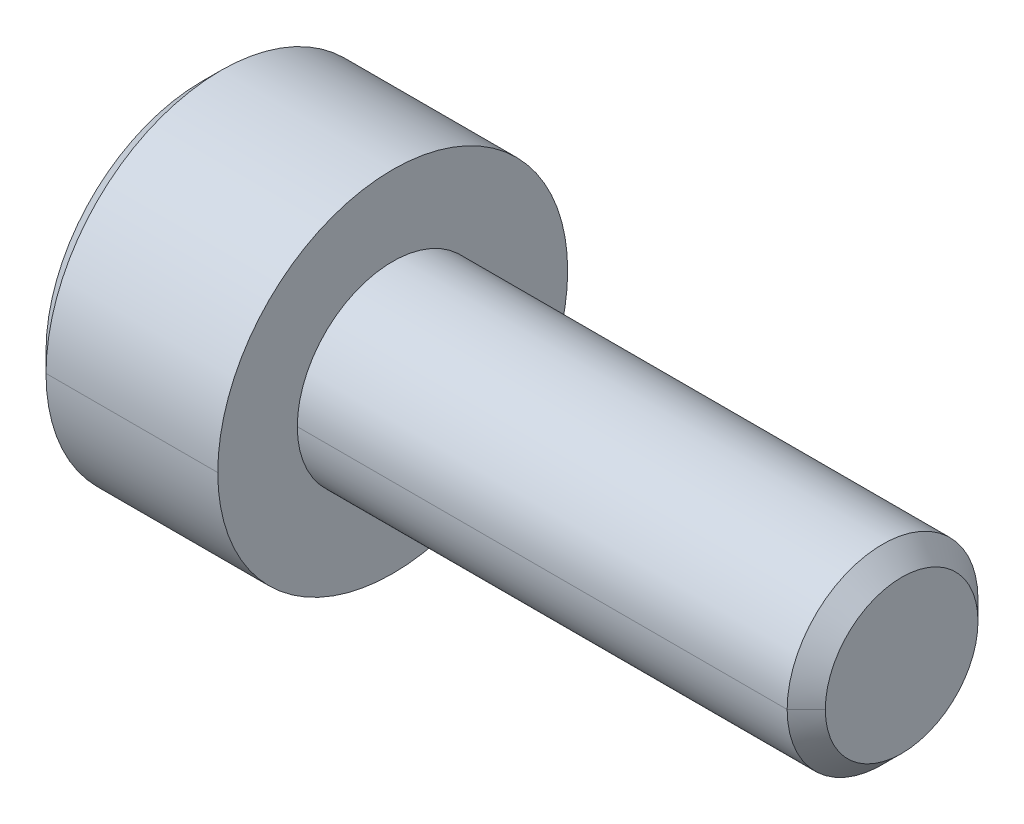
ISO-10303-21;
HEADER;
FILE_DESCRIPTION(('STEP AP214'),'2;1');
FILE_NAME('part.step','',(''),(''),'','','');
FILE_SCHEMA(('AUTOMOTIVE_DESIGN { 1 0 10303 214 1 1 1 1 }'));
ENDSEC;
DATA;
#1=APPLICATION_CONTEXT('core data for automotive mechanical design processes');
#2=APPLICATION_PROTOCOL_DEFINITION('international standard','automotive_design',2000,#1);
#3=PRODUCT_CONTEXT('',#1,'mechanical');
#4=PRODUCT('Part','Part','',(#3));
#5=PRODUCT_RELATED_PRODUCT_CATEGORY('part','',(#4));
#6=PRODUCT_DEFINITION_FORMATION('','',#4);
#7=PRODUCT_DEFINITION_CONTEXT('part definition',#1,'design');
#8=PRODUCT_DEFINITION('design','',#6,#7);
#9=PRODUCT_DEFINITION_SHAPE('','',#8);
#10=(LENGTH_UNIT() NAMED_UNIT(*) SI_UNIT(.MILLI.,.METRE.));
#11=(NAMED_UNIT(*) PLANE_ANGLE_UNIT() SI_UNIT($,.RADIAN.));
#12=(NAMED_UNIT(*) SI_UNIT($,.STERADIAN.) SOLID_ANGLE_UNIT());
#13=UNCERTAINTY_MEASURE_WITH_UNIT(LENGTH_MEASURE(1.E-05),#10,'distance_accuracy_value','');
#14=(GEOMETRIC_REPRESENTATION_CONTEXT(3) GLOBAL_UNCERTAINTY_ASSIGNED_CONTEXT((#13)) GLOBAL_UNIT_ASSIGNED_CONTEXT((#10,
#11,#12)) REPRESENTATION_CONTEXT('',''));
#15=CARTESIAN_POINT('',(0.,0.,0.));
#16=DIRECTION('',(0.,0.,1.));
#17=DIRECTION('',(1.,0.,0.));
#18=AXIS2_PLACEMENT_3D('',#15,#16,#17);
#19=CARTESIAN_POINT('',(-7.2334200260078,3.0068762394076,1.73602080624187));
#20=DIRECTION('',(0.901523057468274,-0.374756097535173,-0.216365533792385));
#21=DIRECTION('',(0.,0.5,-0.866025403784439));
#22=AXIS2_PLACEMENT_3D('',#19,#20,#21);
#23=PLANE('',#22);
#24=DIRECTION('',(0.383848537659809,0.461698034470699,0.799684453457937));
#25=VECTOR('',#24,1.);
#26=CARTESIAN_POINT('',(-9.5,-0.721687836487032,-1.25));
#27=LINE('',#26,#25);
#28=CARTESIAN_POINT('',(-9.5,-0.721687836487032,-1.25));
#29=VERTEX_POINT('',#28);
#30=CARTESIAN_POINT('',(-8.9,0.,0.));
#31=VERTEX_POINT('',#30);
#32=EDGE_CURVE('E258',#29,#31,#27,.T.);
#33=ORIENTED_EDGE('',*,*,#32,.F.);
#34=CARTESIAN_POINT('',(-9.5,-0.721687836487032,-1.25));
#35=CARTESIAN_POINT('',(-9.5,-0.962250448649377,-0.833333333333333));
#36=CARTESIAN_POINT('',(-9.5,-1.20281306081172,-0.416666666666666));
#37=CARTESIAN_POINT('',(-9.5,-1.44337567297406,0.));
#38=(BOUNDED_CURVE() B_SPLINE_CURVE(3,(#34,#35,#36,#37),.UNSPECIFIED.,.F.,
.F.) B_SPLINE_CURVE_WITH_KNOTS((4,4),(0.,1.),
.UNSPECIFIED.) CURVE() GEOMETRIC_REPRESENTATION_ITEM() RATIONAL_B_SPLINE_CURVE((1.,1.,1.,1.)) REPRESENTATION_ITEM(''));
#39=CARTESIAN_POINT('',(-9.5,-1.44337567297406,0.));
#40=VERTEX_POINT('',#39);
#41=EDGE_CURVE('E210',#29,#40,#38,.T.);
#42=ORIENTED_EDGE('',*,*,#41,.T.);
#43=DIRECTION('',(0.383848537659809,0.923396068941397,0.));
#44=VECTOR('',#43,1.);
#45=CARTESIAN_POINT('',(-9.5,-1.44337567297406,0.));
#46=LINE('',#45,#44);
#47=EDGE_CURVE('E10',#40,#31,#46,.T.);
#48=ORIENTED_EDGE('',*,*,#47,.T.);
#49=EDGE_LOOP('',(#33,#42,#48));
#50=FACE_BOUND('',#49,.T.);
#51=ADVANCED_FACE('F16',(#50),#23,.F.);
#52=CARTESIAN_POINT('',(-7.23342002600781,3.00687623940761,-1.73602080624187));
#53=DIRECTION('',(0.901523057468274,-0.374756097535173,0.216365533792385));
#54=DIRECTION('',(0.,-0.5,-0.866025403784439));
#55=AXIS2_PLACEMENT_3D('',#52,#53,#54);
#56=PLANE('',#55);
#57=ORIENTED_EDGE('',*,*,#47,.F.);
#58=CARTESIAN_POINT('',(-9.5,-1.44337567297406,0.));
#59=CARTESIAN_POINT('',(-9.5,-1.20281306081172,0.416666666666667));
#60=CARTESIAN_POINT('',(-9.5,-0.962250448649377,0.833333333333334));
#61=CARTESIAN_POINT('',(-9.5,-0.721687836487033,1.25));
#62=(BOUNDED_CURVE() B_SPLINE_CURVE(3,(#58,#59,#60,#61),.UNSPECIFIED.,.F.,
.F.) B_SPLINE_CURVE_WITH_KNOTS((4,4),(0.,1.),
.UNSPECIFIED.) CURVE() GEOMETRIC_REPRESENTATION_ITEM() RATIONAL_B_SPLINE_CURVE((1.,1.,1.,1.)) REPRESENTATION_ITEM(''));
#63=CARTESIAN_POINT('',(-9.5,-0.721687836487033,1.25));
#64=VERTEX_POINT('',#63);
#65=EDGE_CURVE('E196',#40,#64,#62,.T.);
#66=ORIENTED_EDGE('',*,*,#65,.T.);
#67=DIRECTION('',(0.383848537659809,0.461698034470699,-0.799684453457937));
#68=VECTOR('',#67,1.);
#69=CARTESIAN_POINT('',(-9.5,-0.721687836487033,1.25));
#70=LINE('',#69,#68);
#71=EDGE_CURVE('E27',#64,#31,#70,.T.);
#72=ORIENTED_EDGE('',*,*,#71,.T.);
#73=EDGE_LOOP('',(#57,#66,#72));
#74=FACE_BOUND('',#73,.T.);
#75=ADVANCED_FACE('F307',(#74),#56,.F.);
#76=CARTESIAN_POINT('',(-7.2334200260078,0.,-3.47204161248374));
#77=DIRECTION('',(0.901523057468274,0.,0.432731067584772));
#78=DIRECTION('',(0.,-1.,0.));
#79=AXIS2_PLACEMENT_3D('',#76,#77,#78);
#80=PLANE('',#79);
#81=ORIENTED_EDGE('',*,*,#71,.F.);
#82=CARTESIAN_POINT('',(-9.5,-0.721687836487033,1.25));
#83=CARTESIAN_POINT('',(-9.5,-0.240562612162345,1.25));
#84=CARTESIAN_POINT('',(-9.5,0.240562612162344,1.25));
#85=CARTESIAN_POINT('',(-9.5,0.721687836487033,1.25));
#86=(BOUNDED_CURVE() B_SPLINE_CURVE(3,(#82,#83,#84,#85),.UNSPECIFIED.,.F.,
.F.) B_SPLINE_CURVE_WITH_KNOTS((4,4),(0.,1.),
.UNSPECIFIED.) CURVE() GEOMETRIC_REPRESENTATION_ITEM() RATIONAL_B_SPLINE_CURVE((1.,1.,1.,1.)) REPRESENTATION_ITEM(''));
#87=CARTESIAN_POINT('',(-9.5,0.721687836487033,1.25));
#88=VERTEX_POINT('',#87);
#89=EDGE_CURVE('E136',#64,#88,#86,.T.);
#90=ORIENTED_EDGE('',*,*,#89,.T.);
#91=DIRECTION('',(0.383848537659809,-0.461698034470699,-0.799684453457937));
#92=VECTOR('',#91,1.);
#93=CARTESIAN_POINT('',(-9.5,0.721687836487033,1.25));
#94=LINE('',#93,#92);
#95=EDGE_CURVE('E265',#88,#31,#94,.T.);
#96=ORIENTED_EDGE('',*,*,#95,.T.);
#97=EDGE_LOOP('',(#81,#90,#96));
#98=FACE_BOUND('',#97,.T.);
#99=ADVANCED_FACE('F310',(#98),#80,.F.);
#100=CARTESIAN_POINT('',(-7.2334200260078,-3.00687623940761,-1.73602080624188));
#101=DIRECTION('',(0.901523057468274,0.374756097535173,0.216365533792385));
#102=DIRECTION('',(0.,0.5,-0.866025403784439));
#103=AXIS2_PLACEMENT_3D('',#100,#101,#102);
#104=PLANE('',#103);
#105=ORIENTED_EDGE('',*,*,#95,.F.);
#106=CARTESIAN_POINT('',(-9.5,0.721687836487033,1.25));
#107=CARTESIAN_POINT('',(-9.5,0.962250448649376,0.833333333333332));
#108=CARTESIAN_POINT('',(-9.5,1.20281306081172,0.416666666666666));
#109=CARTESIAN_POINT('',(-9.5,1.44337567297406,0.));
#110=(BOUNDED_CURVE() B_SPLINE_CURVE(3,(#106,#107,#108,#109),.UNSPECIFIED.,.F.,
.F.) B_SPLINE_CURVE_WITH_KNOTS((4,4),(0.,1.),
.UNSPECIFIED.) CURVE() GEOMETRIC_REPRESENTATION_ITEM() RATIONAL_B_SPLINE_CURVE((1.,1.,1.,1.)) REPRESENTATION_ITEM(''));
#111=CARTESIAN_POINT('',(-9.5,1.44337567297406,0.));
#112=VERTEX_POINT('',#111);
#113=EDGE_CURVE('E132',#88,#112,#110,.T.);
#114=ORIENTED_EDGE('',*,*,#113,.T.);
#115=DIRECTION('',(0.383848537659809,-0.923396068941397,0.));
#116=VECTOR('',#115,1.);
#117=CARTESIAN_POINT('',(-9.5,1.44337567297406,0.));
#118=LINE('',#117,#116);
#119=EDGE_CURVE('E166',#112,#31,#118,.T.);
#120=ORIENTED_EDGE('',*,*,#119,.T.);
#121=EDGE_LOOP('',(#105,#114,#120));
#122=FACE_BOUND('',#121,.T.);
#123=ADVANCED_FACE('F319',(#122),#104,.F.);
#124=CARTESIAN_POINT('',(-7.2334200260078,0.,3.47204161248374));
#125=DIRECTION('',(0.901523057468274,0.,-0.432731067584772));
#126=DIRECTION('',(0.,-1.,0.));
#127=AXIS2_PLACEMENT_3D('',#124,#125,#126);
#128=PLANE('',#127);
#129=DIRECTION('',(0.383848537659809,-0.461698034470699,0.799684453457937));
#130=VECTOR('',#129,1.);
#131=CARTESIAN_POINT('',(-9.5,0.721687836487033,-1.25));
#132=LINE('',#131,#130);
#133=CARTESIAN_POINT('',(-9.5,0.721687836487033,-1.25));
#134=VERTEX_POINT('',#133);
#135=EDGE_CURVE('E169',#134,#31,#132,.T.);
#136=ORIENTED_EDGE('',*,*,#135,.F.);
#137=CARTESIAN_POINT('',(-9.5,0.721687836487033,-1.25));
#138=CARTESIAN_POINT('',(-9.5,0.240562612162345,-1.25));
#139=CARTESIAN_POINT('',(-9.5,-0.240562612162344,-1.25));
#140=CARTESIAN_POINT('',(-9.5,-0.721687836487032,-1.25));
#141=(BOUNDED_CURVE() B_SPLINE_CURVE(3,(#137,#138,#139,#140),.UNSPECIFIED.,.F.,
.F.) B_SPLINE_CURVE_WITH_KNOTS((4,4),(0.,1.),
.UNSPECIFIED.) CURVE() GEOMETRIC_REPRESENTATION_ITEM() RATIONAL_B_SPLINE_CURVE((1.,1.,1.,1.)) REPRESENTATION_ITEM(''));
#142=EDGE_CURVE('E209',#134,#29,#141,.T.);
#143=ORIENTED_EDGE('',*,*,#142,.T.);
#144=ORIENTED_EDGE('',*,*,#32,.T.);
#145=EDGE_LOOP('',(#136,#143,#144));
#146=FACE_BOUND('',#145,.T.);
#147=ADVANCED_FACE('F313',(#146),#128,.F.);
#148=CARTESIAN_POINT('',(-7.2334200260078,-3.00687623940761,1.73602080624187));
#149=DIRECTION('',(0.901523057468274,0.374756097535173,-0.216365533792385));
#150=DIRECTION('',(0.,-0.5,-0.866025403784439));
#151=AXIS2_PLACEMENT_3D('',#148,#149,#150);
#152=PLANE('',#151);
#153=ORIENTED_EDGE('',*,*,#119,.F.);
#154=CARTESIAN_POINT('',(-9.5,1.44337567297406,0.));
#155=CARTESIAN_POINT('',(-9.5,1.20281306081172,-0.416666666666666));
#156=CARTESIAN_POINT('',(-9.5,0.962250448649377,-0.833333333333333));
#157=CARTESIAN_POINT('',(-9.5,0.721687836487033,-1.25));
#158=(BOUNDED_CURVE() B_SPLINE_CURVE(3,(#154,#155,#156,#157),.UNSPECIFIED.,.F.,
.F.) B_SPLINE_CURVE_WITH_KNOTS((4,4),(0.,1.),
.UNSPECIFIED.) CURVE() GEOMETRIC_REPRESENTATION_ITEM() RATIONAL_B_SPLINE_CURVE((1.,1.,1.,1.)) REPRESENTATION_ITEM(''));
#159=EDGE_CURVE('E170',#112,#134,#158,.T.);
#160=ORIENTED_EDGE('',*,*,#159,.T.);
#161=ORIENTED_EDGE('',*,*,#135,.T.);
#162=EDGE_LOOP('',(#153,#160,#161));
#163=FACE_BOUND('',#162,.T.);
#164=ADVANCED_FACE('F317',(#163),#152,.F.);
#165=CARTESIAN_POINT('',(-11.,0.,0.));
#166=DIRECTION('',(1.,0.,0.));
#167=DIRECTION('',(0.,0.,-1.));
#168=AXIS2_PLACEMENT_3D('',#165,#166,#167);
#169=CONICAL_SURFACE('',#168,2.45,0.785398163397447);
#170=DIRECTION('',(0.707106781186549,0.,0.707106781186546));
#171=VECTOR('',#170,1.);
#172=CARTESIAN_POINT('',(-11.,0.,2.45));
#173=LINE('',#172,#171);
#174=CARTESIAN_POINT('',(-11.,0.,2.45));
#175=VERTEX_POINT('',#174);
#176=CARTESIAN_POINT('',(-10.7,0.,2.75));
#177=VERTEX_POINT('',#176);
#178=EDGE_CURVE('E211',#175,#177,#173,.T.);
#179=ORIENTED_EDGE('',*,*,#178,.F.);
#180=CARTESIAN_POINT('',(-11.,0.,0.));
#181=DIRECTION('',(-1.,0.,0.));
#182=DIRECTION('',(0.,0.,-1.));
#183=AXIS2_PLACEMENT_3D('',#180,#181,#182);
#184=CIRCLE('',#183,2.45);
#185=CARTESIAN_POINT('',(-11.,0.,-2.45));
#186=VERTEX_POINT('',#185);
#187=EDGE_CURVE('E160',#186,#175,#184,.T.);
#188=ORIENTED_EDGE('',*,*,#187,.F.);
#189=DIRECTION('',(0.707106781186549,0.,-0.707106781186546));
#190=VECTOR('',#189,1.);
#191=CARTESIAN_POINT('',(-11.,0.,-2.45));
#192=LINE('',#191,#190);
#193=CARTESIAN_POINT('',(-10.7,0.,-2.75));
#194=VERTEX_POINT('',#193);
#195=EDGE_CURVE('E171',#186,#194,#192,.T.);
#196=ORIENTED_EDGE('',*,*,#195,.T.);
#197=CARTESIAN_POINT('',(-10.7,0.,0.));
#198=DIRECTION('',(1.,0.,0.));
#199=DIRECTION('',(0.,0.,-1.));
#200=AXIS2_PLACEMENT_3D('',#197,#198,#199);
#201=CIRCLE('',#200,2.75);
#202=EDGE_CURVE('E20',#177,#194,#201,.T.);
#203=ORIENTED_EDGE('',*,*,#202,.F.);
#204=EDGE_LOOP('',(#179,#188,#196,#203));
#205=FACE_BOUND('',#204,.T.);
#206=ADVANCED_FACE('F477',(#205),#169,.T.);
#207=CARTESIAN_POINT('',(-9.5,1.44337567297406,0.));
#208=DIRECTION('',(0.,0.866025403784439,-0.5));
#209=DIRECTION('',(-1.,0.,0.));
#210=AXIS2_PLACEMENT_3D('',#207,#208,#209);
#211=PLANE('',#210);
#212=DIRECTION('',(0.,-0.5,-0.866025403784439));
#213=VECTOR('',#212,1.);
#214=CARTESIAN_POINT('',(-11.,1.44337567297406,0.));
#215=LINE('',#214,#213);
#216=CARTESIAN_POINT('',(-11.,1.44337567297406,0.));
#217=VERTEX_POINT('',#216);
#218=CARTESIAN_POINT('',(-11.,0.721687836487033,-1.25));
#219=VERTEX_POINT('',#218);
#220=EDGE_CURVE('E152',#217,#219,#215,.T.);
#221=ORIENTED_EDGE('',*,*,#220,.T.);
#222=DIRECTION('',(-1.,0.,0.));
#223=VECTOR('',#222,1.);
#224=CARTESIAN_POINT('',(-9.5,0.721687836487033,-1.25));
#225=LINE('',#224,#223);
#226=EDGE_CURVE('E115',#134,#219,#225,.T.);
#227=ORIENTED_EDGE('',*,*,#226,.F.);
#228=ORIENTED_EDGE('',*,*,#159,.F.);
#229=DIRECTION('',(-1.,0.,0.));
#230=VECTOR('',#229,1.);
#231=CARTESIAN_POINT('',(-9.5,1.44337567297406,0.));
#232=LINE('',#231,#230);
#233=EDGE_CURVE('E222',#112,#217,#232,.T.);
#234=ORIENTED_EDGE('',*,*,#233,.T.);
#235=EDGE_LOOP('',(#221,#227,#228,#234));
#236=FACE_BOUND('',#235,.T.);
#237=ADVANCED_FACE('F323',(#236),#211,.F.);
#238=CARTESIAN_POINT('',(-9.5,0.721687836487033,-1.25));
#239=DIRECTION('',(0.,0.,-1.));
#240=DIRECTION('',(0.,-1.,0.));
#241=AXIS2_PLACEMENT_3D('',#238,#239,#240);
#242=PLANE('',#241);
#243=DIRECTION('',(0.,-1.,0.));
#244=VECTOR('',#243,1.);
#245=CARTESIAN_POINT('',(-11.,0.721687836487033,-1.25));
#246=LINE('',#245,#244);
#247=CARTESIAN_POINT('',(-11.,-0.721687836487032,-1.25));
#248=VERTEX_POINT('',#247);
#249=EDGE_CURVE('E225',#219,#248,#246,.T.);
#250=ORIENTED_EDGE('',*,*,#249,.T.);
#251=DIRECTION('',(-1.,0.,0.));
#252=VECTOR('',#251,1.);
#253=CARTESIAN_POINT('',(-9.5,-0.721687836487032,-1.25));
#254=LINE('',#253,#252);
#255=EDGE_CURVE('E203',#29,#248,#254,.T.);
#256=ORIENTED_EDGE('',*,*,#255,.F.);
#257=ORIENTED_EDGE('',*,*,#142,.F.);
#258=ORIENTED_EDGE('',*,*,#226,.T.);
#259=EDGE_LOOP('',(#250,#256,#257,#258));
#260=FACE_BOUND('',#259,.T.);
#261=ADVANCED_FACE('F324',(#260),#242,.F.);
#262=CARTESIAN_POINT('',(-9.5,-0.721687836487032,-1.25));
#263=DIRECTION('',(0.,-0.866025403784439,-0.5));
#264=DIRECTION('',(0.,0.5,-0.866025403784439));
#265=AXIS2_PLACEMENT_3D('',#262,#263,#264);
#266=PLANE('',#265);
#267=DIRECTION('',(0.,-0.5,0.866025403784439));
#268=VECTOR('',#267,1.);
#269=CARTESIAN_POINT('',(-11.,-0.721687836487032,-1.25));
#270=LINE('',#269,#268);
#271=CARTESIAN_POINT('',(-11.,-1.44337567297406,0.));
#272=VERTEX_POINT('',#271);
#273=EDGE_CURVE('E292',#248,#272,#270,.T.);
#274=ORIENTED_EDGE('',*,*,#273,.T.);
#275=DIRECTION('',(-1.,0.,0.));
#276=VECTOR('',#275,1.);
#277=CARTESIAN_POINT('',(-9.5,-1.44337567297406,0.));
#278=LINE('',#277,#276);
#279=EDGE_CURVE('E202',#40,#272,#278,.T.);
#280=ORIENTED_EDGE('',*,*,#279,.F.);
#281=ORIENTED_EDGE('',*,*,#41,.F.);
#282=ORIENTED_EDGE('',*,*,#255,.T.);
#283=EDGE_LOOP('',(#274,#280,#281,#282));
#284=FACE_BOUND('',#283,.T.);
#285=ADVANCED_FACE('F330',(#284),#266,.F.);
#286=CARTESIAN_POINT('',(-9.5,-1.44337567297406,0.));
#287=DIRECTION('',(0.,-0.866025403784439,0.5));
#288=DIRECTION('',(-1.,0.,0.));
#289=AXIS2_PLACEMENT_3D('',#286,#287,#288);
#290=PLANE('',#289);
#291=DIRECTION('',(0.,0.5,0.866025403784439));
#292=VECTOR('',#291,1.);
#293=CARTESIAN_POINT('',(-11.,-1.44337567297406,0.));
#294=LINE('',#293,#292);
#295=CARTESIAN_POINT('',(-11.,-0.721687836487033,1.25));
#296=VERTEX_POINT('',#295);
#297=EDGE_CURVE('E147',#272,#296,#294,.T.);
#298=ORIENTED_EDGE('',*,*,#297,.T.);
#299=DIRECTION('',(-1.,0.,0.));
#300=VECTOR('',#299,1.);
#301=CARTESIAN_POINT('',(-9.5,-0.721687836487033,1.25));
#302=LINE('',#301,#300);
#303=EDGE_CURVE('E142',#64,#296,#302,.T.);
#304=ORIENTED_EDGE('',*,*,#303,.F.);
#305=ORIENTED_EDGE('',*,*,#65,.F.);
#306=ORIENTED_EDGE('',*,*,#279,.T.);
#307=EDGE_LOOP('',(#298,#304,#305,#306));
#308=FACE_BOUND('',#307,.T.);
#309=ADVANCED_FACE('F348',(#308),#290,.F.);
#310=CARTESIAN_POINT('',(-9.5,-0.721687836487033,1.25));
#311=DIRECTION('',(0.,0.,1.));
#312=DIRECTION('',(1.,0.,0.));
#313=AXIS2_PLACEMENT_3D('',#310,#311,#312);
#314=PLANE('',#313);
#315=DIRECTION('',(0.,1.,0.));
#316=VECTOR('',#315,1.);
#317=CARTESIAN_POINT('',(-11.,-0.721687836487033,1.25));
#318=LINE('',#317,#316);
#319=CARTESIAN_POINT('',(-11.,0.721687836487033,1.25));
#320=VERTEX_POINT('',#319);
#321=EDGE_CURVE('E139',#296,#320,#318,.T.);
#322=ORIENTED_EDGE('',*,*,#321,.T.);
#323=DIRECTION('',(-1.,0.,0.));
#324=VECTOR('',#323,1.);
#325=CARTESIAN_POINT('',(-9.5,0.721687836487033,1.25));
#326=LINE('',#325,#324);
#327=EDGE_CURVE('E125',#88,#320,#326,.T.);
#328=ORIENTED_EDGE('',*,*,#327,.F.);
#329=ORIENTED_EDGE('',*,*,#89,.F.);
#330=ORIENTED_EDGE('',*,*,#303,.T.);
#331=EDGE_LOOP('',(#322,#328,#329,#330));
#332=FACE_BOUND('',#331,.T.);
#333=ADVANCED_FACE('F140',(#332),#314,.F.);
#334=CARTESIAN_POINT('',(-9.5,0.721687836487033,1.25));
#335=DIRECTION('',(0.,0.866025403784439,0.5));
#336=DIRECTION('',(1.,0.,0.));
#337=AXIS2_PLACEMENT_3D('',#334,#335,#336);
#338=PLANE('',#337);
#339=DIRECTION('',(0.,0.5,-0.866025403784439));
#340=VECTOR('',#339,1.);
#341=CARTESIAN_POINT('',(-11.,0.721687836487033,1.25));
#342=LINE('',#341,#340);
#343=EDGE_CURVE('E129',#320,#217,#342,.T.);
#344=ORIENTED_EDGE('',*,*,#343,.T.);
#345=ORIENTED_EDGE('',*,*,#233,.F.);
#346=ORIENTED_EDGE('',*,*,#113,.F.);
#347=ORIENTED_EDGE('',*,*,#327,.T.);
#348=EDGE_LOOP('',(#344,#345,#346,#347));
#349=FACE_BOUND('',#348,.T.);
#350=ADVANCED_FACE('F18',(#349),#338,.F.);
#351=CARTESIAN_POINT('',(-0.3,0.,0.));
#352=DIRECTION('',(-1.,0.,0.));
#353=DIRECTION('',(0.,0.,1.));
#354=AXIS2_PLACEMENT_3D('',#351,#352,#353);
#355=CONICAL_SURFACE('',#354,1.5,0.785398163397448);
#356=DIRECTION('',(-0.707106781186548,0.,-0.707106781186548));
#357=VECTOR('',#356,1.);
#358=CARTESIAN_POINT('',(-0.3,0.,-1.5));
#359=LINE('',#358,#357);
#360=CARTESIAN_POINT('',(0.,0.,-1.2));
#361=VERTEX_POINT('',#360);
#362=CARTESIAN_POINT('',(-0.3,0.,-1.5));
#363=VERTEX_POINT('',#362);
#364=EDGE_CURVE('E195',#361,#363,#359,.T.);
#365=ORIENTED_EDGE('',*,*,#364,.F.);
#366=CARTESIAN_POINT('',(0.,0.,0.));
#367=DIRECTION('',(1.,0.,0.));
#368=DIRECTION('',(0.,0.,1.));
#369=AXIS2_PLACEMENT_3D('',#366,#367,#368);
#370=CIRCLE('',#369,1.2);
#371=CARTESIAN_POINT('',(0.,0.,1.2));
#372=VERTEX_POINT('',#371);
#373=EDGE_CURVE('E177',#372,#361,#370,.T.);
#374=ORIENTED_EDGE('',*,*,#373,.F.);
#375=DIRECTION('',(-0.707106781186548,0.,0.707106781186548));
#376=VECTOR('',#375,1.);
#377=CARTESIAN_POINT('',(-0.3,0.,1.5));
#378=LINE('',#377,#376);
#379=CARTESIAN_POINT('',(-0.3,0.,1.5));
#380=VERTEX_POINT('',#379);
#381=EDGE_CURVE('E164',#372,#380,#378,.T.);
#382=ORIENTED_EDGE('',*,*,#381,.T.);
#383=CARTESIAN_POINT('',(-0.3,0.,0.));
#384=DIRECTION('',(-1.,0.,0.));
#385=DIRECTION('',(0.,0.,1.));
#386=AXIS2_PLACEMENT_3D('',#383,#384,#385);
#387=CIRCLE('',#386,1.5);
#388=EDGE_CURVE('E180',#363,#380,#387,.T.);
#389=ORIENTED_EDGE('',*,*,#388,.F.);
#390=EDGE_LOOP('',(#365,#374,#382,#389));
#391=FACE_BOUND('',#390,.T.);
#392=ADVANCED_FACE('F373',(#391),#355,.T.);
#393=CARTESIAN_POINT('',(-11.,2.75,0.));
#394=DIRECTION('',(1.,0.,0.));
#395=DIRECTION('',(0.,1.,0.));
#396=AXIS2_PLACEMENT_3D('',#393,#394,#395);
#397=PLANE('',#396);
#398=ORIENTED_EDGE('',*,*,#220,.F.);
#399=ORIENTED_EDGE('',*,*,#343,.F.);
#400=ORIENTED_EDGE('',*,*,#321,.F.);
#401=ORIENTED_EDGE('',*,*,#297,.F.);
#402=ORIENTED_EDGE('',*,*,#273,.F.);
#403=ORIENTED_EDGE('',*,*,#249,.F.);
#404=EDGE_LOOP('',(#398,#399,#400,#401,#402,#403));
#405=FACE_BOUND('',#404,.T.);
#406=ORIENTED_EDGE('',*,*,#187,.T.);
#407=CARTESIAN_POINT('',(-11.,0.,0.));
#408=DIRECTION('',(-1.,0.,0.));
#409=DIRECTION('',(0.,0.,-1.));
#410=AXIS2_PLACEMENT_3D('',#407,#408,#409);
#411=CIRCLE('',#410,2.45);
#412=EDGE_CURVE('E214',#175,#186,#411,.T.);
#413=ORIENTED_EDGE('',*,*,#412,.T.);
#414=EDGE_LOOP('',(#406,#413));
#415=FACE_BOUND('',#414,.T.);
#416=ADVANCED_FACE('F149',(#405,#415),#397,.F.);
#417=CARTESIAN_POINT('',(0.,0.,0.));
#418=DIRECTION('',(-1.,0.,0.));
#419=DIRECTION('',(0.,0.,1.));
#420=AXIS2_PLACEMENT_3D('',#417,#418,#419);
#421=CYLINDRICAL_SURFACE('',#420,2.75);
#422=DIRECTION('',(-1.,0.,0.));
#423=VECTOR('',#422,1.);
#424=CARTESIAN_POINT('',(0.,0.,-2.75));
#425=LINE('',#424,#423);
#426=CARTESIAN_POINT('',(-8.,0.,-2.75));
#427=VERTEX_POINT('',#426);
#428=EDGE_CURVE('E237',#427,#194,#425,.T.);
#429=ORIENTED_EDGE('',*,*,#428,.F.);
#430=CARTESIAN_POINT('',(-8.,0.,0.));
#431=DIRECTION('',(-1.,0.,0.));
#432=DIRECTION('',(0.,0.,1.));
#433=AXIS2_PLACEMENT_3D('',#430,#431,#432);
#434=CIRCLE('',#433,2.75);
#435=CARTESIAN_POINT('',(-8.,0.,2.75));
#436=VERTEX_POINT('',#435);
#437=EDGE_CURVE('E188',#427,#436,#434,.T.);
#438=ORIENTED_EDGE('',*,*,#437,.T.);
#439=DIRECTION('',(-1.,0.,0.));
#440=VECTOR('',#439,1.);
#441=CARTESIAN_POINT('',(0.,0.,2.75));
#442=LINE('',#441,#440);
#443=EDGE_CURVE('E187',#436,#177,#442,.T.);
#444=ORIENTED_EDGE('',*,*,#443,.T.);
#445=ORIENTED_EDGE('',*,*,#202,.T.);
#446=EDGE_LOOP('',(#429,#438,#444,#445));
#447=FACE_BOUND('',#446,.T.);
#448=ADVANCED_FACE('F408',(#447),#421,.T.);
#449=CARTESIAN_POINT('',(-8.,1.5,0.));
#450=DIRECTION('',(-1.,0.,0.));
#451=DIRECTION('',(0.,0.,1.));
#452=AXIS2_PLACEMENT_3D('',#449,#450,#451);
#453=PLANE('',#452);
#454=CARTESIAN_POINT('',(-8.,0.,0.));
#455=DIRECTION('',(-1.,0.,0.));
#456=DIRECTION('',(0.,0.,1.));
#457=AXIS2_PLACEMENT_3D('',#454,#455,#456);
#458=CIRCLE('',#457,1.5);
#459=CARTESIAN_POINT('',(-8.,0.,1.5));
#460=VERTEX_POINT('',#459);
#461=CARTESIAN_POINT('',(-8.,0.,-1.5));
#462=VERTEX_POINT('',#461);
#463=EDGE_CURVE('E186',#460,#462,#458,.T.);
#464=ORIENTED_EDGE('',*,*,#463,.T.);
#465=CARTESIAN_POINT('',(-8.,0.,0.));
#466=DIRECTION('',(-1.,0.,0.));
#467=DIRECTION('',(0.,0.,1.));
#468=AXIS2_PLACEMENT_3D('',#465,#466,#467);
#469=CIRCLE('',#468,1.5);
#470=EDGE_CURVE('E190',#462,#460,#469,.T.);
#471=ORIENTED_EDGE('',*,*,#470,.T.);
#472=EDGE_LOOP('',(#464,#471));
#473=FACE_BOUND('',#472,.T.);
#474=CARTESIAN_POINT('',(-8.,0.,0.));
#475=DIRECTION('',(-1.,0.,0.));
#476=DIRECTION('',(0.,0.,1.));
#477=AXIS2_PLACEMENT_3D('',#474,#475,#476);
#478=CIRCLE('',#477,2.75);
#479=EDGE_CURVE('E241',#436,#427,#478,.T.);
#480=ORIENTED_EDGE('',*,*,#479,.F.);
#481=ORIENTED_EDGE('',*,*,#437,.F.);
#482=EDGE_LOOP('',(#480,#481));
#483=FACE_BOUND('',#482,.T.);
#484=ADVANCED_FACE('F396',(#473,#483),#453,.F.);
#485=CARTESIAN_POINT('',(0.,0.,0.));
#486=DIRECTION('',(-1.,0.,0.));
#487=DIRECTION('',(0.,0.,1.));
#488=AXIS2_PLACEMENT_3D('',#485,#486,#487);
#489=CYLINDRICAL_SURFACE('',#488,1.5);
#490=DIRECTION('',(-1.,0.,0.));
#491=VECTOR('',#490,1.);
#492=CARTESIAN_POINT('',(0.,0.,-1.5));
#493=LINE('',#492,#491);
#494=EDGE_CURVE('E182',#363,#462,#493,.T.);
#495=ORIENTED_EDGE('',*,*,#494,.F.);
#496=ORIENTED_EDGE('',*,*,#388,.T.);
#497=DIRECTION('',(-1.,0.,0.));
#498=VECTOR('',#497,1.);
#499=CARTESIAN_POINT('',(0.,0.,1.5));
#500=LINE('',#499,#498);
#501=EDGE_CURVE('E181',#380,#460,#500,.T.);
#502=ORIENTED_EDGE('',*,*,#501,.T.);
#503=ORIENTED_EDGE('',*,*,#470,.F.);
#504=EDGE_LOOP('',(#495,#496,#502,#503));
#505=FACE_BOUND('',#504,.T.);
#506=ADVANCED_FACE('F379',(#505),#489,.T.);
#507=CARTESIAN_POINT('',(0.,0.,0.));
#508=DIRECTION('',(-1.,0.,0.));
#509=DIRECTION('',(0.,0.,1.));
#510=AXIS2_PLACEMENT_3D('',#507,#508,#509);
#511=PLANE('',#510);
#512=ORIENTED_EDGE('',*,*,#373,.T.);
#513=CARTESIAN_POINT('',(0.,0.,0.));
#514=DIRECTION('',(1.,0.,0.));
#515=DIRECTION('',(0.,0.,1.));
#516=AXIS2_PLACEMENT_3D('',#513,#514,#515);
#517=CIRCLE('',#516,1.2);
#518=EDGE_CURVE('E175',#361,#372,#517,.T.);
#519=ORIENTED_EDGE('',*,*,#518,.T.);
#520=EDGE_LOOP('',(#512,#519));
#521=FACE_BOUND('',#520,.T.);
#522=ADVANCED_FACE('F386',(#521),#511,.F.);
#523=CARTESIAN_POINT('',(0.,0.,0.));
#524=DIRECTION('',(-1.,0.,0.));
#525=DIRECTION('',(0.,0.,1.));
#526=AXIS2_PLACEMENT_3D('',#523,#524,#525);
#527=CYLINDRICAL_SURFACE('',#526,1.5);
#528=CARTESIAN_POINT('',(-0.3,0.,0.));
#529=DIRECTION('',(-1.,0.,0.));
#530=DIRECTION('',(0.,0.,1.));
#531=AXIS2_PLACEMENT_3D('',#528,#529,#530);
#532=CIRCLE('',#531,1.5);
#533=EDGE_CURVE('E272',#380,#363,#532,.T.);
#534=ORIENTED_EDGE('',*,*,#533,.T.);
#535=ORIENTED_EDGE('',*,*,#494,.T.);
#536=ORIENTED_EDGE('',*,*,#463,.F.);
#537=ORIENTED_EDGE('',*,*,#501,.F.);
#538=EDGE_LOOP('',(#534,#535,#536,#537));
#539=FACE_BOUND('',#538,.T.);
#540=ADVANCED_FACE('F382',(#539),#527,.T.);
#541=CARTESIAN_POINT('',(0.,0.,0.));
#542=DIRECTION('',(-1.,0.,0.));
#543=DIRECTION('',(0.,0.,1.));
#544=AXIS2_PLACEMENT_3D('',#541,#542,#543);
#545=CYLINDRICAL_SURFACE('',#544,2.75);
#546=ORIENTED_EDGE('',*,*,#479,.T.);
#547=ORIENTED_EDGE('',*,*,#428,.T.);
#548=CARTESIAN_POINT('',(-10.7,0.,0.));
#549=DIRECTION('',(1.,0.,0.));
#550=DIRECTION('',(0.,0.,-1.));
#551=AXIS2_PLACEMENT_3D('',#548,#549,#550);
#552=CIRCLE('',#551,2.75);
#553=EDGE_CURVE('E176',#194,#177,#552,.T.);
#554=ORIENTED_EDGE('',*,*,#553,.T.);
#555=ORIENTED_EDGE('',*,*,#443,.F.);
#556=EDGE_LOOP('',(#546,#547,#554,#555));
#557=FACE_BOUND('',#556,.T.);
#558=ADVANCED_FACE('F394',(#557),#545,.T.);
#559=CARTESIAN_POINT('',(-0.3,0.,0.));
#560=DIRECTION('',(-1.,0.,0.));
#561=DIRECTION('',(0.,0.,1.));
#562=AXIS2_PLACEMENT_3D('',#559,#560,#561);
#563=CONICAL_SURFACE('',#562,1.5,0.785398163397448);
#564=ORIENTED_EDGE('',*,*,#518,.F.);
#565=ORIENTED_EDGE('',*,*,#364,.T.);
#566=ORIENTED_EDGE('',*,*,#533,.F.);
#567=ORIENTED_EDGE('',*,*,#381,.F.);
#568=EDGE_LOOP('',(#564,#565,#566,#567));
#569=FACE_BOUND('',#568,.T.);
#570=ADVANCED_FACE('F384',(#569),#563,.T.);
#571=CARTESIAN_POINT('',(-11.,0.,0.));
#572=DIRECTION('',(1.,0.,0.));
#573=DIRECTION('',(0.,0.,-1.));
#574=AXIS2_PLACEMENT_3D('',#571,#572,#573);
#575=CONICAL_SURFACE('',#574,2.45,0.785398163397447);
#576=ORIENTED_EDGE('',*,*,#412,.F.);
#577=ORIENTED_EDGE('',*,*,#178,.T.);
#578=ORIENTED_EDGE('',*,*,#553,.F.);
#579=ORIENTED_EDGE('',*,*,#195,.F.);
#580=EDGE_LOOP('',(#576,#577,#578,#579));
#581=FACE_BOUND('',#580,.T.);
#582=ADVANCED_FACE('F551',(#581),#575,.T.);
#583=CLOSED_SHELL('',(#51,#75,#99,#123,#147,#164,#206,#237,#261,#285,#309,#333,#350,#392,#416,
#448,#484,#506,#522,#540,#558,#570,#582));
#584=MANIFOLD_SOLID_BREP('B1',#583);
#585=ADVANCED_BREP_SHAPE_REPRESENTATION('',(#18,#584),#14);
#586=SHAPE_DEFINITION_REPRESENTATION(#9,#585);
ENDSEC;
END-ISO-10303-21;
